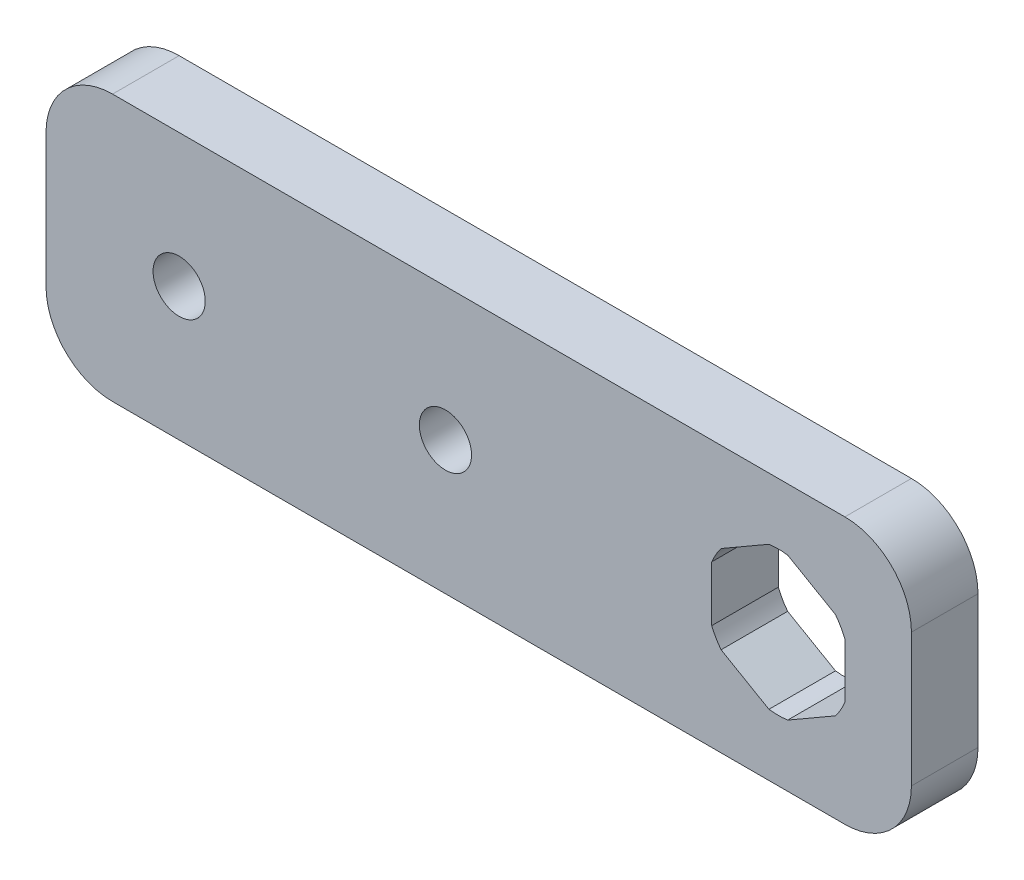
ISO-10303-21;
HEADER;
FILE_DESCRIPTION(('STEP AP214'),'2;1');
FILE_NAME('part.step','',(''),(''),'','','');
FILE_SCHEMA(('AUTOMOTIVE_DESIGN { 1 0 10303 214 1 1 1 1 }'));
ENDSEC;
DATA;
#1=APPLICATION_CONTEXT('core data for automotive mechanical design processes');
#2=APPLICATION_PROTOCOL_DEFINITION('international standard','automotive_design',2000,#1);
#3=PRODUCT_CONTEXT('',#1,'mechanical');
#4=PRODUCT('Part','Part','',(#3));
#5=PRODUCT_RELATED_PRODUCT_CATEGORY('part','',(#4));
#6=PRODUCT_DEFINITION_FORMATION('','',#4);
#7=PRODUCT_DEFINITION_CONTEXT('part definition',#1,'design');
#8=PRODUCT_DEFINITION('design','',#6,#7);
#9=PRODUCT_DEFINITION_SHAPE('','',#8);
#10=(LENGTH_UNIT() NAMED_UNIT(*) SI_UNIT(.MILLI.,.METRE.));
#11=(NAMED_UNIT(*) PLANE_ANGLE_UNIT() SI_UNIT($,.RADIAN.));
#12=(NAMED_UNIT(*) SI_UNIT($,.STERADIAN.) SOLID_ANGLE_UNIT());
#13=UNCERTAINTY_MEASURE_WITH_UNIT(LENGTH_MEASURE(1.E-05),#10,'distance_accuracy_value','');
#14=(GEOMETRIC_REPRESENTATION_CONTEXT(3) GLOBAL_UNCERTAINTY_ASSIGNED_CONTEXT((#13)) GLOBAL_UNIT_ASSIGNED_CONTEXT((#10,
#11,#12)) REPRESENTATION_CONTEXT('',''));
#15=CARTESIAN_POINT('',(0.,0.,0.));
#16=DIRECTION('',(0.,0.,1.));
#17=DIRECTION('',(1.,0.,0.));
#18=AXIS2_PLACEMENT_3D('',#15,#16,#17);
#19=CARTESIAN_POINT('',(114.3,169.926,-6.35));
#20=DIRECTION('',(-1.,0.,0.));
#21=DIRECTION('',(0.,-1.,0.));
#22=AXIS2_PLACEMENT_3D('',#19,#20,#21);
#23=PLANE('',#22);
#24=DIRECTION('',(0.,-1.,0.));
#25=VECTOR('',#24,1.);
#26=CARTESIAN_POINT('',(114.3,169.926,0.));
#27=LINE('',#26,#25);
#28=CARTESIAN_POINT('',(114.3,163.576,0.));
#29=VERTEX_POINT('',#28);
#30=CARTESIAN_POINT('',(114.3,150.876,0.));
#31=VERTEX_POINT('',#30);
#32=EDGE_CURVE('E303',#29,#31,#27,.T.);
#33=ORIENTED_EDGE('',*,*,#32,.F.);
#34=DIRECTION('',(0.,0.,1.));
#35=VECTOR('',#34,1.);
#36=CARTESIAN_POINT('',(114.3,163.576,-6.35));
#37=LINE('',#36,#35);
#38=CARTESIAN_POINT('',(114.3,163.576,-6.35));
#39=VERTEX_POINT('',#38);
#40=EDGE_CURVE('E386',#29,#39,#37,.F.);
#41=ORIENTED_EDGE('',*,*,#40,.T.);
#42=DIRECTION('',(0.,-1.,0.));
#43=VECTOR('',#42,1.);
#44=CARTESIAN_POINT('',(114.3,169.926,-6.35));
#45=LINE('',#44,#43);
#46=CARTESIAN_POINT('',(114.3,150.876,-6.35));
#47=VERTEX_POINT('',#46);
#48=EDGE_CURVE('E333',#39,#47,#45,.T.);
#49=ORIENTED_EDGE('',*,*,#48,.T.);
#50=DIRECTION('',(0.,0.,1.));
#51=VECTOR('',#50,1.);
#52=CARTESIAN_POINT('',(114.3,150.876,-6.35));
#53=LINE('',#52,#51);
#54=EDGE_CURVE('E382',#47,#31,#53,.T.);
#55=ORIENTED_EDGE('',*,*,#54,.T.);
#56=EDGE_LOOP('',(#33,#41,#49,#55));
#57=FACE_BOUND('',#56,.T.);
#58=ADVANCED_FACE('F47',(#57),#23,.T.);
#59=CARTESIAN_POINT('',(114.3,169.926,-6.35));
#60=DIRECTION('',(0.,1.,0.));
#61=DIRECTION('',(0.,0.,1.));
#62=AXIS2_PLACEMENT_3D('',#59,#60,#61);
#63=PLANE('',#62);
#64=DIRECTION('',(-1.,0.,0.));
#65=VECTOR('',#64,1.);
#66=CARTESIAN_POINT('',(114.3,169.926,-6.35));
#67=LINE('',#66,#65);
#68=CARTESIAN_POINT('',(190.5,169.926,-6.35));
#69=VERTEX_POINT('',#68);
#70=CARTESIAN_POINT('',(120.65,169.926,-6.35));
#71=VERTEX_POINT('',#70);
#72=EDGE_CURVE('E345',#69,#71,#67,.T.);
#73=ORIENTED_EDGE('',*,*,#72,.T.);
#74=DIRECTION('',(0.,0.,1.));
#75=VECTOR('',#74,1.);
#76=CARTESIAN_POINT('',(120.65,169.926,-6.35));
#77=LINE('',#76,#75);
#78=CARTESIAN_POINT('',(120.65,169.926,0.));
#79=VERTEX_POINT('',#78);
#80=EDGE_CURVE('E366',#71,#79,#77,.T.);
#81=ORIENTED_EDGE('',*,*,#80,.T.);
#82=DIRECTION('',(-1.,0.,0.));
#83=VECTOR('',#82,1.);
#84=CARTESIAN_POINT('',(114.3,169.926,0.));
#85=LINE('',#84,#83);
#86=CARTESIAN_POINT('',(190.5,169.926,0.));
#87=VERTEX_POINT('',#86);
#88=EDGE_CURVE('E338',#87,#79,#85,.T.);
#89=ORIENTED_EDGE('',*,*,#88,.F.);
#90=DIRECTION('',(0.,0.,1.));
#91=VECTOR('',#90,1.);
#92=CARTESIAN_POINT('',(190.5,169.926,-6.35));
#93=LINE('',#92,#91);
#94=EDGE_CURVE('E349',#87,#69,#93,.F.);
#95=ORIENTED_EDGE('',*,*,#94,.T.);
#96=EDGE_LOOP('',(#73,#81,#89,#95));
#97=FACE_BOUND('',#96,.T.);
#98=ADVANCED_FACE('F434',(#97),#63,.T.);
#99=CARTESIAN_POINT('',(196.85,169.926,-6.35));
#100=DIRECTION('',(1.,0.,0.));
#101=DIRECTION('',(0.,0.,-1.));
#102=AXIS2_PLACEMENT_3D('',#99,#100,#101);
#103=PLANE('',#102);
#104=DIRECTION('',(0.,1.,0.));
#105=VECTOR('',#104,1.);
#106=CARTESIAN_POINT('',(196.85,169.926,0.));
#107=LINE('',#106,#105);
#108=CARTESIAN_POINT('',(196.85,150.876,0.));
#109=VERTEX_POINT('',#108);
#110=CARTESIAN_POINT('',(196.85,163.576,0.));
#111=VERTEX_POINT('',#110);
#112=EDGE_CURVE('E357',#109,#111,#107,.T.);
#113=ORIENTED_EDGE('',*,*,#112,.F.);
#114=DIRECTION('',(0.,0.,1.));
#115=VECTOR('',#114,1.);
#116=CARTESIAN_POINT('',(196.85,150.876,-6.35));
#117=LINE('',#116,#115);
#118=CARTESIAN_POINT('',(196.85,150.876,-6.35));
#119=VERTEX_POINT('',#118);
#120=EDGE_CURVE('E11',#109,#119,#117,.F.);
#121=ORIENTED_EDGE('',*,*,#120,.T.);
#122=DIRECTION('',(0.,1.,0.));
#123=VECTOR('',#122,1.);
#124=CARTESIAN_POINT('',(196.85,169.926,-6.35));
#125=LINE('',#124,#123);
#126=CARTESIAN_POINT('',(196.85,163.576,-6.35));
#127=VERTEX_POINT('',#126);
#128=EDGE_CURVE('E341',#119,#127,#125,.T.);
#129=ORIENTED_EDGE('',*,*,#128,.T.);
#130=DIRECTION('',(0.,0.,1.));
#131=VECTOR('',#130,1.);
#132=CARTESIAN_POINT('',(196.85,163.576,-6.35));
#133=LINE('',#132,#131);
#134=EDGE_CURVE('E56',#127,#111,#133,.T.);
#135=ORIENTED_EDGE('',*,*,#134,.T.);
#136=EDGE_LOOP('',(#113,#121,#129,#135));
#137=FACE_BOUND('',#136,.T.);
#138=ADVANCED_FACE('F410',(#137),#103,.T.);
#139=CARTESIAN_POINT('',(114.3,144.526,-6.35));
#140=DIRECTION('',(0.,-1.,0.));
#141=DIRECTION('',(0.,0.,-1.));
#142=AXIS2_PLACEMENT_3D('',#139,#140,#141);
#143=PLANE('',#142);
#144=DIRECTION('',(1.,0.,0.));
#145=VECTOR('',#144,1.);
#146=CARTESIAN_POINT('',(114.3,144.526,0.));
#147=LINE('',#146,#145);
#148=CARTESIAN_POINT('',(120.65,144.526,0.));
#149=VERTEX_POINT('',#148);
#150=CARTESIAN_POINT('',(190.5,144.526,0.));
#151=VERTEX_POINT('',#150);
#152=EDGE_CURVE('E353',#149,#151,#147,.T.);
#153=ORIENTED_EDGE('',*,*,#152,.F.);
#154=DIRECTION('',(0.,0.,1.));
#155=VECTOR('',#154,1.);
#156=CARTESIAN_POINT('',(120.65,144.526,-6.35));
#157=LINE('',#156,#155);
#158=CARTESIAN_POINT('',(120.65,144.526,-6.35));
#159=VERTEX_POINT('',#158);
#160=EDGE_CURVE('E70',#149,#159,#157,.F.);
#161=ORIENTED_EDGE('',*,*,#160,.T.);
#162=DIRECTION('',(1.,0.,0.));
#163=VECTOR('',#162,1.);
#164=CARTESIAN_POINT('',(114.3,144.526,-6.35));
#165=LINE('',#164,#163);
#166=CARTESIAN_POINT('',(190.5,144.526,-6.35));
#167=VERTEX_POINT('',#166);
#168=EDGE_CURVE('E337',#159,#167,#165,.T.);
#169=ORIENTED_EDGE('',*,*,#168,.T.);
#170=DIRECTION('',(0.,0.,1.));
#171=VECTOR('',#170,1.);
#172=CARTESIAN_POINT('',(190.5,144.526,-6.35));
#173=LINE('',#172,#171);
#174=EDGE_CURVE('E400',#167,#151,#173,.T.);
#175=ORIENTED_EDGE('',*,*,#174,.T.);
#176=EDGE_LOOP('',(#153,#161,#169,#175));
#177=FACE_BOUND('',#176,.T.);
#178=ADVANCED_FACE('F420',(#177),#143,.T.);
#179=CARTESIAN_POINT('',(0.,0.,-6.35));
#180=DIRECTION('',(0.,0.,1.));
#181=DIRECTION('',(1.,0.,0.));
#182=AXIS2_PLACEMENT_3D('',#179,#180,#181);
#183=PLANE('',#182);
#184=CARTESIAN_POINT('',(152.4,157.226,-6.35));
#185=DIRECTION('',(0.,0.,1.));
#186=DIRECTION('',(1.,0.,0.));
#187=AXIS2_PLACEMENT_3D('',#184,#185,#186);
#188=CIRCLE('',#187,2.48920000000001);
#189=CARTESIAN_POINT('',(154.8892,157.226,-6.35));
#190=VERTEX_POINT('',#189);
#191=EDGE_CURVE('E642',#190,#190,#188,.T.);
#192=ORIENTED_EDGE('',*,*,#191,.T.);
#193=EDGE_LOOP('',(#192));
#194=FACE_BOUND('',#193,.T.);
#195=CARTESIAN_POINT('',(127.,157.226,-6.35));
#196=DIRECTION('',(0.,0.,1.));
#197=DIRECTION('',(1.,0.,0.));
#198=AXIS2_PLACEMENT_3D('',#195,#196,#197);
#199=CIRCLE('',#198,2.48920000000001);
#200=CARTESIAN_POINT('',(129.4892,157.226,-6.35));
#201=VERTEX_POINT('',#200);
#202=EDGE_CURVE('E262',#201,#201,#199,.T.);
#203=ORIENTED_EDGE('',*,*,#202,.T.);
#204=EDGE_LOOP('',(#203));
#205=FACE_BOUND('',#204,.T.);
#206=DIRECTION('',(-0.866025403784439,0.499999999999999,0.));
#207=VECTOR('',#206,1.);
#208=CARTESIAN_POINT('',(189.606960428968,161.407770846087,-6.35));
#209=LINE('',#208,#207);
#210=CARTESIAN_POINT('',(189.606960428968,161.407770846087,-6.35));
#211=VERTEX_POINT('',#210);
#212=CARTESIAN_POINT('',(185.043039571032,164.042751781976,-6.35));
#213=VERTEX_POINT('',#212);
#214=EDGE_CURVE('E199',#211,#213,#209,.T.);
#215=ORIENTED_EDGE('',*,*,#214,.T.);
#216=CARTESIAN_POINT('',(184.15,157.226,-6.35));
#217=DIRECTION('',(0.,0.,1.));
#218=DIRECTION('',(1.,0.,0.));
#219=AXIS2_PLACEMENT_3D('',#216,#217,#218);
#220=CIRCLE('',#219,6.874999966);
#221=CARTESIAN_POINT('',(183.256960428968,164.042751781976,-6.35));
#222=VERTEX_POINT('',#221);
#223=EDGE_CURVE('E190',#213,#222,#220,.T.);
#224=ORIENTED_EDGE('',*,*,#223,.T.);
#225=DIRECTION('',(-0.866025403784439,-0.5,0.));
#226=VECTOR('',#225,1.);
#227=CARTESIAN_POINT('',(183.256960428968,164.042751781976,-6.35));
#228=LINE('',#227,#226);
#229=CARTESIAN_POINT('',(178.693039571032,161.407770846087,-6.35));
#230=VERTEX_POINT('',#229);
#231=EDGE_CURVE('E203',#222,#230,#228,.T.);
#232=ORIENTED_EDGE('',*,*,#231,.T.);
#233=CARTESIAN_POINT('',(184.15,157.226,-6.35));
#234=DIRECTION('',(0.,0.,1.));
#235=DIRECTION('',(1.,0.,0.));
#236=AXIS2_PLACEMENT_3D('',#233,#234,#235);
#237=CIRCLE('',#236,6.874999966);
#238=CARTESIAN_POINT('',(177.8,159.860980935889,-6.35));
#239=VERTEX_POINT('',#238);
#240=EDGE_CURVE('E208',#230,#239,#237,.T.);
#241=ORIENTED_EDGE('',*,*,#240,.T.);
#242=DIRECTION('',(0.,-1.,0.));
#243=VECTOR('',#242,1.);
#244=CARTESIAN_POINT('',(177.8,159.860980935889,-6.35));
#245=LINE('',#244,#243);
#246=CARTESIAN_POINT('',(177.8,154.591019064111,-6.35));
#247=VERTEX_POINT('',#246);
#248=EDGE_CURVE('E226',#239,#247,#245,.T.);
#249=ORIENTED_EDGE('',*,*,#248,.T.);
#250=CARTESIAN_POINT('',(184.15,157.226,-6.35));
#251=DIRECTION('',(0.,0.,1.));
#252=DIRECTION('',(1.,0.,0.));
#253=AXIS2_PLACEMENT_3D('',#250,#251,#252);
#254=CIRCLE('',#253,6.874999966);
#255=CARTESIAN_POINT('',(178.693039571032,153.044229153913,-6.35));
#256=VERTEX_POINT('',#255);
#257=EDGE_CURVE('E230',#247,#256,#254,.T.);
#258=ORIENTED_EDGE('',*,*,#257,.T.);
#259=DIRECTION('',(0.866025403784442,-0.499999999999994,0.));
#260=VECTOR('',#259,1.);
#261=CARTESIAN_POINT('',(178.693039571032,153.044229153913,-6.35));
#262=LINE('',#261,#260);
#263=CARTESIAN_POINT('',(183.256960428967,150.409248218024,-6.35));
#264=VERTEX_POINT('',#263);
#265=EDGE_CURVE('E234',#256,#264,#262,.T.);
#266=ORIENTED_EDGE('',*,*,#265,.T.);
#267=CARTESIAN_POINT('',(184.15,157.226,-6.35));
#268=DIRECTION('',(0.,0.,1.));
#269=DIRECTION('',(1.,0.,0.));
#270=AXIS2_PLACEMENT_3D('',#267,#268,#269);
#271=CIRCLE('',#270,6.87499996600001);
#272=CARTESIAN_POINT('',(185.043039571033,150.409248218024,-6.35));
#273=VERTEX_POINT('',#272);
#274=EDGE_CURVE('E238',#264,#273,#271,.T.);
#275=ORIENTED_EDGE('',*,*,#274,.T.);
#276=DIRECTION('',(0.866025403784441,0.499999999999995,0.));
#277=VECTOR('',#276,1.);
#278=CARTESIAN_POINT('',(185.043039571033,150.409248218024,-6.35));
#279=LINE('',#278,#277);
#280=CARTESIAN_POINT('',(189.606960428968,153.044229153913,-6.35));
#281=VERTEX_POINT('',#280);
#282=EDGE_CURVE('E242',#273,#281,#279,.T.);
#283=ORIENTED_EDGE('',*,*,#282,.T.);
#284=CARTESIAN_POINT('',(184.15,157.226,-6.35));
#285=DIRECTION('',(0.,0.,1.));
#286=DIRECTION('',(1.,0.,0.));
#287=AXIS2_PLACEMENT_3D('',#284,#285,#286);
#288=CIRCLE('',#287,6.87499996600001);
#289=CARTESIAN_POINT('',(190.5,154.591019064111,-6.35));
#290=VERTEX_POINT('',#289);
#291=EDGE_CURVE('E246',#281,#290,#288,.T.);
#292=ORIENTED_EDGE('',*,*,#291,.T.);
#293=DIRECTION('',(0.,1.,0.));
#294=VECTOR('',#293,1.);
#295=CARTESIAN_POINT('',(190.5,154.591019064111,-6.35));
#296=LINE('',#295,#294);
#297=CARTESIAN_POINT('',(190.5,159.860980935889,-6.35));
#298=VERTEX_POINT('',#297);
#299=EDGE_CURVE('E250',#290,#298,#296,.T.);
#300=ORIENTED_EDGE('',*,*,#299,.T.);
#301=CARTESIAN_POINT('',(184.15,157.226,-6.35));
#302=DIRECTION('',(0.,0.,1.));
#303=DIRECTION('',(1.,0.,0.));
#304=AXIS2_PLACEMENT_3D('',#301,#302,#303);
#305=CIRCLE('',#304,6.874999966);
#306=EDGE_CURVE('E254',#298,#211,#305,.T.);
#307=ORIENTED_EDGE('',*,*,#306,.T.);
#308=EDGE_LOOP('',(#215,#224,#232,#241,#249,#258,#266,#275,#283,#292,#300,#307));
#309=FACE_BOUND('',#308,.T.);
#310=ORIENTED_EDGE('',*,*,#48,.F.);
#311=CARTESIAN_POINT('',(120.65,163.576,-6.35));
#312=DIRECTION('',(0.,0.,1.));
#313=DIRECTION('',(1.,0.,0.));
#314=AXIS2_PLACEMENT_3D('',#311,#312,#313);
#315=CIRCLE('',#314,6.35);
#316=EDGE_CURVE('E397',#39,#71,#315,.F.);
#317=ORIENTED_EDGE('',*,*,#316,.T.);
#318=ORIENTED_EDGE('',*,*,#72,.F.);
#319=CARTESIAN_POINT('',(190.5,163.576,-6.35));
#320=DIRECTION('',(0.,0.,1.));
#321=DIRECTION('',(1.,0.,0.));
#322=AXIS2_PLACEMENT_3D('',#319,#320,#321);
#323=CIRCLE('',#322,6.35);
#324=EDGE_CURVE('E389',#69,#127,#323,.F.);
#325=ORIENTED_EDGE('',*,*,#324,.T.);
#326=ORIENTED_EDGE('',*,*,#128,.F.);
#327=CARTESIAN_POINT('',(190.5,150.876,-6.35));
#328=DIRECTION('',(0.,0.,1.));
#329=DIRECTION('',(1.,0.,0.));
#330=AXIS2_PLACEMENT_3D('',#327,#328,#329);
#331=CIRCLE('',#330,6.35);
#332=EDGE_CURVE('E63',#119,#167,#331,.F.);
#333=ORIENTED_EDGE('',*,*,#332,.T.);
#334=ORIENTED_EDGE('',*,*,#168,.F.);
#335=CARTESIAN_POINT('',(120.65,150.876,-6.35));
#336=DIRECTION('',(0.,0.,1.));
#337=DIRECTION('',(1.,0.,0.));
#338=AXIS2_PLACEMENT_3D('',#335,#336,#337);
#339=CIRCLE('',#338,6.35);
#340=EDGE_CURVE('E394',#159,#47,#339,.F.);
#341=ORIENTED_EDGE('',*,*,#340,.T.);
#342=EDGE_LOOP('',(#310,#317,#318,#325,#326,#333,#334,#341));
#343=FACE_BOUND('',#342,.T.);
#344=ADVANCED_FACE('F210',(#194,#205,#309,#343),#183,.F.);
#345=CARTESIAN_POINT('',(0.,0.,0.));
#346=DIRECTION('',(0.,0.,1.));
#347=DIRECTION('',(1.,0.,0.));
#348=AXIS2_PLACEMENT_3D('',#345,#346,#347);
#349=PLANE('',#348);
#350=CARTESIAN_POINT('',(152.4,157.226,0.));
#351=DIRECTION('',(0.,0.,1.));
#352=DIRECTION('',(1.,0.,0.));
#353=AXIS2_PLACEMENT_3D('',#350,#351,#352);
#354=CIRCLE('',#353,2.48920000000001);
#355=CARTESIAN_POINT('',(154.8892,157.226,0.));
#356=VERTEX_POINT('',#355);
#357=EDGE_CURVE('E649',#356,#356,#354,.T.);
#358=ORIENTED_EDGE('',*,*,#357,.F.);
#359=EDGE_LOOP('',(#358));
#360=FACE_BOUND('',#359,.T.);
#361=CARTESIAN_POINT('',(127.,157.226,0.));
#362=DIRECTION('',(0.,0.,1.));
#363=DIRECTION('',(1.,0.,0.));
#364=AXIS2_PLACEMENT_3D('',#361,#362,#363);
#365=CIRCLE('',#364,2.48920000000001);
#366=CARTESIAN_POINT('',(129.4892,157.226,0.));
#367=VERTEX_POINT('',#366);
#368=EDGE_CURVE('E221',#367,#367,#365,.T.);
#369=ORIENTED_EDGE('',*,*,#368,.F.);
#370=EDGE_LOOP('',(#369));
#371=FACE_BOUND('',#370,.T.);
#372=CARTESIAN_POINT('',(184.15,157.226,0.));
#373=DIRECTION('',(0.,0.,1.));
#374=DIRECTION('',(1.,0.,0.));
#375=AXIS2_PLACEMENT_3D('',#372,#373,#374);
#376=CIRCLE('',#375,6.874999966);
#377=CARTESIAN_POINT('',(185.043039571032,164.042751781976,0.));
#378=VERTEX_POINT('',#377);
#379=CARTESIAN_POINT('',(183.256960428968,164.042751781976,0.));
#380=VERTEX_POINT('',#379);
#381=EDGE_CURVE('E193',#378,#380,#376,.T.);
#382=ORIENTED_EDGE('',*,*,#381,.F.);
#383=DIRECTION('',(-0.866025403784439,0.499999999999999,0.));
#384=VECTOR('',#383,1.);
#385=CARTESIAN_POINT('',(189.606960428968,161.407770846087,0.));
#386=LINE('',#385,#384);
#387=CARTESIAN_POINT('',(189.606960428968,161.407770846087,0.));
#388=VERTEX_POINT('',#387);
#389=EDGE_CURVE('E214',#388,#378,#386,.T.);
#390=ORIENTED_EDGE('',*,*,#389,.F.);
#391=CARTESIAN_POINT('',(184.15,157.226,0.));
#392=DIRECTION('',(0.,0.,1.));
#393=DIRECTION('',(1.,0.,0.));
#394=AXIS2_PLACEMENT_3D('',#391,#392,#393);
#395=CIRCLE('',#394,6.874999966);
#396=CARTESIAN_POINT('',(190.5,159.860980935889,0.));
#397=VERTEX_POINT('',#396);
#398=EDGE_CURVE('E218',#397,#388,#395,.T.);
#399=ORIENTED_EDGE('',*,*,#398,.F.);
#400=DIRECTION('',(0.,1.,0.));
#401=VECTOR('',#400,1.);
#402=CARTESIAN_POINT('',(190.5,154.591019064111,0.));
#403=LINE('',#402,#401);
#404=CARTESIAN_POINT('',(190.5,154.591019064111,0.));
#405=VERTEX_POINT('',#404);
#406=EDGE_CURVE('E293',#405,#397,#403,.T.);
#407=ORIENTED_EDGE('',*,*,#406,.F.);
#408=CARTESIAN_POINT('',(184.15,157.226,0.));
#409=DIRECTION('',(0.,0.,1.));
#410=DIRECTION('',(1.,0.,0.));
#411=AXIS2_PLACEMENT_3D('',#408,#409,#410);
#412=CIRCLE('',#411,6.87499996600001);
#413=CARTESIAN_POINT('',(189.606960428968,153.044229153913,0.));
#414=VERTEX_POINT('',#413);
#415=EDGE_CURVE('E289',#414,#405,#412,.T.);
#416=ORIENTED_EDGE('',*,*,#415,.F.);
#417=DIRECTION('',(0.866025403784441,0.499999999999995,0.));
#418=VECTOR('',#417,1.);
#419=CARTESIAN_POINT('',(185.043039571033,150.409248218024,0.));
#420=LINE('',#419,#418);
#421=CARTESIAN_POINT('',(185.043039571033,150.409248218024,0.));
#422=VERTEX_POINT('',#421);
#423=EDGE_CURVE('E285',#422,#414,#420,.T.);
#424=ORIENTED_EDGE('',*,*,#423,.F.);
#425=CARTESIAN_POINT('',(184.15,157.226,0.));
#426=DIRECTION('',(0.,0.,1.));
#427=DIRECTION('',(1.,0.,0.));
#428=AXIS2_PLACEMENT_3D('',#425,#426,#427);
#429=CIRCLE('',#428,6.87499996600001);
#430=CARTESIAN_POINT('',(183.256960428967,150.409248218024,0.));
#431=VERTEX_POINT('',#430);
#432=EDGE_CURVE('E281',#431,#422,#429,.T.);
#433=ORIENTED_EDGE('',*,*,#432,.F.);
#434=DIRECTION('',(0.866025403784442,-0.499999999999994,0.));
#435=VECTOR('',#434,1.);
#436=CARTESIAN_POINT('',(178.693039571032,153.044229153913,0.));
#437=LINE('',#436,#435);
#438=CARTESIAN_POINT('',(178.693039571032,153.044229153913,0.));
#439=VERTEX_POINT('',#438);
#440=EDGE_CURVE('E277',#439,#431,#437,.T.);
#441=ORIENTED_EDGE('',*,*,#440,.F.);
#442=CARTESIAN_POINT('',(184.15,157.226,0.));
#443=DIRECTION('',(0.,0.,1.));
#444=DIRECTION('',(1.,0.,0.));
#445=AXIS2_PLACEMENT_3D('',#442,#443,#444);
#446=CIRCLE('',#445,6.874999966);
#447=CARTESIAN_POINT('',(177.8,154.591019064111,0.));
#448=VERTEX_POINT('',#447);
#449=EDGE_CURVE('E273',#448,#439,#446,.T.);
#450=ORIENTED_EDGE('',*,*,#449,.F.);
#451=DIRECTION('',(0.,-1.,0.));
#452=VECTOR('',#451,1.);
#453=CARTESIAN_POINT('',(177.8,159.860980935889,0.));
#454=LINE('',#453,#452);
#455=CARTESIAN_POINT('',(177.8,159.860980935889,0.));
#456=VERTEX_POINT('',#455);
#457=EDGE_CURVE('E269',#456,#448,#454,.T.);
#458=ORIENTED_EDGE('',*,*,#457,.F.);
#459=CARTESIAN_POINT('',(184.15,157.226,0.));
#460=DIRECTION('',(0.,0.,1.));
#461=DIRECTION('',(1.,0.,0.));
#462=AXIS2_PLACEMENT_3D('',#459,#460,#461);
#463=CIRCLE('',#462,6.874999966);
#464=CARTESIAN_POINT('',(178.693039571032,161.407770846087,0.));
#465=VERTEX_POINT('',#464);
#466=EDGE_CURVE('E265',#465,#456,#463,.T.);
#467=ORIENTED_EDGE('',*,*,#466,.F.);
#468=DIRECTION('',(-0.866025403784439,-0.5,0.));
#469=VECTOR('',#468,1.);
#470=CARTESIAN_POINT('',(183.256960428968,164.042751781976,0.));
#471=LINE('',#470,#469);
#472=EDGE_CURVE('E261',#380,#465,#471,.T.);
#473=ORIENTED_EDGE('',*,*,#472,.F.);
#474=EDGE_LOOP('',(#382,#390,#399,#407,#416,#424,#433,#441,#450,#458,#467,#473));
#475=FACE_BOUND('',#474,.T.);
#476=ORIENTED_EDGE('',*,*,#88,.T.);
#477=CARTESIAN_POINT('',(120.65,163.576,0.));
#478=DIRECTION('',(0.,0.,1.));
#479=DIRECTION('',(1.,0.,0.));
#480=AXIS2_PLACEMENT_3D('',#477,#478,#479);
#481=CIRCLE('',#480,6.35);
#482=EDGE_CURVE('E379',#79,#29,#481,.T.);
#483=ORIENTED_EDGE('',*,*,#482,.T.);
#484=ORIENTED_EDGE('',*,*,#32,.T.);
#485=CARTESIAN_POINT('',(120.65,150.876,0.));
#486=DIRECTION('',(0.,0.,1.));
#487=DIRECTION('',(1.,0.,0.));
#488=AXIS2_PLACEMENT_3D('',#485,#486,#487);
#489=CIRCLE('',#488,6.35);
#490=EDGE_CURVE('E376',#31,#149,#489,.T.);
#491=ORIENTED_EDGE('',*,*,#490,.T.);
#492=ORIENTED_EDGE('',*,*,#152,.T.);
#493=CARTESIAN_POINT('',(190.5,150.876,0.));
#494=DIRECTION('',(0.,0.,1.));
#495=DIRECTION('',(1.,0.,0.));
#496=AXIS2_PLACEMENT_3D('',#493,#494,#495);
#497=CIRCLE('',#496,6.35);
#498=EDGE_CURVE('E373',#151,#109,#497,.T.);
#499=ORIENTED_EDGE('',*,*,#498,.T.);
#500=ORIENTED_EDGE('',*,*,#112,.T.);
#501=CARTESIAN_POINT('',(190.5,163.576,0.));
#502=DIRECTION('',(0.,0.,1.));
#503=DIRECTION('',(1.,0.,0.));
#504=AXIS2_PLACEMENT_3D('',#501,#502,#503);
#505=CIRCLE('',#504,6.35);
#506=EDGE_CURVE('E370',#111,#87,#505,.T.);
#507=ORIENTED_EDGE('',*,*,#506,.T.);
#508=EDGE_LOOP('',(#476,#483,#484,#491,#492,#499,#500,#507));
#509=FACE_BOUND('',#508,.T.);
#510=ADVANCED_FACE('F415',(#360,#371,#475,#509),#349,.T.);
#511=CARTESIAN_POINT('',(184.15,157.226,-6.35));
#512=DIRECTION('',(0.,0.,1.));
#513=DIRECTION('',(1.,0.,0.));
#514=AXIS2_PLACEMENT_3D('',#511,#512,#513);
#515=CYLINDRICAL_SURFACE('',#514,6.874999966);
#516=ORIENTED_EDGE('',*,*,#381,.T.);
#517=DIRECTION('',(0.,0.,1.));
#518=VECTOR('',#517,1.);
#519=CARTESIAN_POINT('',(183.256960428968,164.042751781976,-6.35));
#520=LINE('',#519,#518);
#521=EDGE_CURVE('E186',#222,#380,#520,.T.);
#522=ORIENTED_EDGE('',*,*,#521,.F.);
#523=ORIENTED_EDGE('',*,*,#223,.F.);
#524=DIRECTION('',(0.,0.,1.));
#525=VECTOR('',#524,1.);
#526=CARTESIAN_POINT('',(185.043039571032,164.042751781976,-6.35));
#527=LINE('',#526,#525);
#528=EDGE_CURVE('E300',#213,#378,#527,.T.);
#529=ORIENTED_EDGE('',*,*,#528,.T.);
#530=EDGE_LOOP('',(#516,#522,#523,#529));
#531=FACE_BOUND('',#530,.T.);
#532=ADVANCED_FACE('F188',(#531),#515,.F.);
#533=CARTESIAN_POINT('',(189.606960428968,161.407770846087,-6.35));
#534=DIRECTION('',(0.499999999999999,0.866025403784439,0.));
#535=DIRECTION('',(-0.866025403784439,0.499999999999999,0.));
#536=AXIS2_PLACEMENT_3D('',#533,#534,#535);
#537=PLANE('',#536);
#538=ORIENTED_EDGE('',*,*,#389,.T.);
#539=ORIENTED_EDGE('',*,*,#528,.F.);
#540=ORIENTED_EDGE('',*,*,#214,.F.);
#541=DIRECTION('',(0.,0.,1.));
#542=VECTOR('',#541,1.);
#543=CARTESIAN_POINT('',(189.606960428968,161.407770846087,-6.35));
#544=LINE('',#543,#542);
#545=EDGE_CURVE('E304',#211,#388,#544,.T.);
#546=ORIENTED_EDGE('',*,*,#545,.T.);
#547=EDGE_LOOP('',(#538,#539,#540,#546));
#548=FACE_BOUND('',#547,.T.);
#549=ADVANCED_FACE('F579',(#548),#537,.F.);
#550=CARTESIAN_POINT('',(184.15,157.226,-6.35));
#551=DIRECTION('',(0.,0.,1.));
#552=DIRECTION('',(1.,0.,0.));
#553=AXIS2_PLACEMENT_3D('',#550,#551,#552);
#554=CYLINDRICAL_SURFACE('',#553,6.874999966);
#555=ORIENTED_EDGE('',*,*,#398,.T.);
#556=ORIENTED_EDGE('',*,*,#545,.F.);
#557=ORIENTED_EDGE('',*,*,#306,.F.);
#558=DIRECTION('',(0.,0.,1.));
#559=VECTOR('',#558,1.);
#560=CARTESIAN_POINT('',(190.5,159.860980935889,-6.35));
#561=LINE('',#560,#559);
#562=EDGE_CURVE('E307',#298,#397,#561,.T.);
#563=ORIENTED_EDGE('',*,*,#562,.T.);
#564=EDGE_LOOP('',(#555,#556,#557,#563));
#565=FACE_BOUND('',#564,.T.);
#566=ADVANCED_FACE('F570',(#565),#554,.F.);
#567=CARTESIAN_POINT('',(190.5,154.591019064111,-6.35));
#568=DIRECTION('',(1.,0.,0.));
#569=DIRECTION('',(0.,0.,-1.));
#570=AXIS2_PLACEMENT_3D('',#567,#568,#569);
#571=PLANE('',#570);
#572=ORIENTED_EDGE('',*,*,#406,.T.);
#573=ORIENTED_EDGE('',*,*,#562,.F.);
#574=ORIENTED_EDGE('',*,*,#299,.F.);
#575=DIRECTION('',(0.,0.,1.));
#576=VECTOR('',#575,1.);
#577=CARTESIAN_POINT('',(190.5,154.591019064111,-6.35));
#578=LINE('',#577,#576);
#579=EDGE_CURVE('E310',#290,#405,#578,.T.);
#580=ORIENTED_EDGE('',*,*,#579,.T.);
#581=EDGE_LOOP('',(#572,#573,#574,#580));
#582=FACE_BOUND('',#581,.T.);
#583=ADVANCED_FACE('F561',(#582),#571,.F.);
#584=CARTESIAN_POINT('',(184.15,157.226,-6.35));
#585=DIRECTION('',(0.,0.,1.));
#586=DIRECTION('',(1.,0.,0.));
#587=AXIS2_PLACEMENT_3D('',#584,#585,#586);
#588=CYLINDRICAL_SURFACE('',#587,6.87499996600001);
#589=ORIENTED_EDGE('',*,*,#415,.T.);
#590=ORIENTED_EDGE('',*,*,#579,.F.);
#591=ORIENTED_EDGE('',*,*,#291,.F.);
#592=DIRECTION('',(0.,0.,1.));
#593=VECTOR('',#592,1.);
#594=CARTESIAN_POINT('',(189.606960428968,153.044229153913,-6.35));
#595=LINE('',#594,#593);
#596=EDGE_CURVE('E313',#281,#414,#595,.T.);
#597=ORIENTED_EDGE('',*,*,#596,.T.);
#598=EDGE_LOOP('',(#589,#590,#591,#597));
#599=FACE_BOUND('',#598,.T.);
#600=ADVANCED_FACE('F552',(#599),#588,.F.);
#601=CARTESIAN_POINT('',(185.043039571033,150.409248218024,-6.35));
#602=DIRECTION('',(0.499999999999995,-0.866025403784441,0.));
#603=DIRECTION('',(0.866025403784441,0.499999999999995,0.));
#604=AXIS2_PLACEMENT_3D('',#601,#602,#603);
#605=PLANE('',#604);
#606=ORIENTED_EDGE('',*,*,#423,.T.);
#607=ORIENTED_EDGE('',*,*,#596,.F.);
#608=ORIENTED_EDGE('',*,*,#282,.F.);
#609=DIRECTION('',(0.,0.,1.));
#610=VECTOR('',#609,1.);
#611=CARTESIAN_POINT('',(185.043039571033,150.409248218024,-6.35));
#612=LINE('',#611,#610);
#613=EDGE_CURVE('E316',#273,#422,#612,.T.);
#614=ORIENTED_EDGE('',*,*,#613,.T.);
#615=EDGE_LOOP('',(#606,#607,#608,#614));
#616=FACE_BOUND('',#615,.T.);
#617=ADVANCED_FACE('F543',(#616),#605,.F.);
#618=CARTESIAN_POINT('',(184.15,157.226,-6.35));
#619=DIRECTION('',(0.,0.,1.));
#620=DIRECTION('',(1.,0.,0.));
#621=AXIS2_PLACEMENT_3D('',#618,#619,#620);
#622=CYLINDRICAL_SURFACE('',#621,6.87499996600001);
#623=ORIENTED_EDGE('',*,*,#432,.T.);
#624=ORIENTED_EDGE('',*,*,#613,.F.);
#625=ORIENTED_EDGE('',*,*,#274,.F.);
#626=DIRECTION('',(0.,0.,1.));
#627=VECTOR('',#626,1.);
#628=CARTESIAN_POINT('',(183.256960428967,150.409248218024,-6.35));
#629=LINE('',#628,#627);
#630=EDGE_CURVE('E319',#264,#431,#629,.T.);
#631=ORIENTED_EDGE('',*,*,#630,.T.);
#632=EDGE_LOOP('',(#623,#624,#625,#631));
#633=FACE_BOUND('',#632,.T.);
#634=ADVANCED_FACE('F534',(#633),#622,.F.);
#635=CARTESIAN_POINT('',(178.693039571032,153.044229153913,-6.35));
#636=DIRECTION('',(-0.499999999999994,-0.866025403784442,0.));
#637=DIRECTION('',(0.866025403784442,-0.499999999999994,0.));
#638=AXIS2_PLACEMENT_3D('',#635,#636,#637);
#639=PLANE('',#638);
#640=ORIENTED_EDGE('',*,*,#440,.T.);
#641=ORIENTED_EDGE('',*,*,#630,.F.);
#642=ORIENTED_EDGE('',*,*,#265,.F.);
#643=DIRECTION('',(0.,0.,1.));
#644=VECTOR('',#643,1.);
#645=CARTESIAN_POINT('',(178.693039571032,153.044229153913,-6.35));
#646=LINE('',#645,#644);
#647=EDGE_CURVE('E322',#256,#439,#646,.T.);
#648=ORIENTED_EDGE('',*,*,#647,.T.);
#649=EDGE_LOOP('',(#640,#641,#642,#648));
#650=FACE_BOUND('',#649,.T.);
#651=ADVANCED_FACE('F525',(#650),#639,.F.);
#652=CARTESIAN_POINT('',(184.15,157.226,-6.35));
#653=DIRECTION('',(0.,0.,1.));
#654=DIRECTION('',(1.,0.,0.));
#655=AXIS2_PLACEMENT_3D('',#652,#653,#654);
#656=CYLINDRICAL_SURFACE('',#655,6.874999966);
#657=ORIENTED_EDGE('',*,*,#449,.T.);
#658=ORIENTED_EDGE('',*,*,#647,.F.);
#659=ORIENTED_EDGE('',*,*,#257,.F.);
#660=DIRECTION('',(0.,0.,1.));
#661=VECTOR('',#660,1.);
#662=CARTESIAN_POINT('',(177.8,154.591019064111,-6.35));
#663=LINE('',#662,#661);
#664=EDGE_CURVE('E325',#247,#448,#663,.T.);
#665=ORIENTED_EDGE('',*,*,#664,.T.);
#666=EDGE_LOOP('',(#657,#658,#659,#665));
#667=FACE_BOUND('',#666,.T.);
#668=ADVANCED_FACE('F516',(#667),#656,.F.);
#669=CARTESIAN_POINT('',(177.8,159.860980935889,-6.35));
#670=DIRECTION('',(-1.,0.,0.));
#671=DIRECTION('',(0.,0.,1.));
#672=AXIS2_PLACEMENT_3D('',#669,#670,#671);
#673=PLANE('',#672);
#674=ORIENTED_EDGE('',*,*,#457,.T.);
#675=ORIENTED_EDGE('',*,*,#664,.F.);
#676=ORIENTED_EDGE('',*,*,#248,.F.);
#677=DIRECTION('',(0.,0.,1.));
#678=VECTOR('',#677,1.);
#679=CARTESIAN_POINT('',(177.8,159.860980935889,-6.35));
#680=LINE('',#679,#678);
#681=EDGE_CURVE('E328',#239,#456,#680,.T.);
#682=ORIENTED_EDGE('',*,*,#681,.T.);
#683=EDGE_LOOP('',(#674,#675,#676,#682));
#684=FACE_BOUND('',#683,.T.);
#685=ADVANCED_FACE('F507',(#684),#673,.F.);
#686=CARTESIAN_POINT('',(184.15,157.226,-6.35));
#687=DIRECTION('',(0.,0.,1.));
#688=DIRECTION('',(1.,0.,0.));
#689=AXIS2_PLACEMENT_3D('',#686,#687,#688);
#690=CYLINDRICAL_SURFACE('',#689,6.874999966);
#691=ORIENTED_EDGE('',*,*,#466,.T.);
#692=ORIENTED_EDGE('',*,*,#681,.F.);
#693=ORIENTED_EDGE('',*,*,#240,.F.);
#694=DIRECTION('',(0.,0.,1.));
#695=VECTOR('',#694,1.);
#696=CARTESIAN_POINT('',(178.693039571032,161.407770846087,-6.35));
#697=LINE('',#696,#695);
#698=EDGE_CURVE('E198',#230,#465,#697,.T.);
#699=ORIENTED_EDGE('',*,*,#698,.T.);
#700=EDGE_LOOP('',(#691,#692,#693,#699));
#701=FACE_BOUND('',#700,.T.);
#702=ADVANCED_FACE('F499',(#701),#690,.F.);
#703=CARTESIAN_POINT('',(183.256960428968,164.042751781976,-6.35));
#704=DIRECTION('',(-0.5,0.866025403784439,0.));
#705=DIRECTION('',(-0.866025403784439,-0.5,0.));
#706=AXIS2_PLACEMENT_3D('',#703,#704,#705);
#707=PLANE('',#706);
#708=ORIENTED_EDGE('',*,*,#472,.T.);
#709=ORIENTED_EDGE('',*,*,#698,.F.);
#710=ORIENTED_EDGE('',*,*,#231,.F.);
#711=ORIENTED_EDGE('',*,*,#521,.T.);
#712=EDGE_LOOP('',(#708,#709,#710,#711));
#713=FACE_BOUND('',#712,.T.);
#714=ADVANCED_FACE('F204',(#713),#707,.F.);
#715=CARTESIAN_POINT('',(127.,157.226,-6.35));
#716=DIRECTION('',(0.,0.,1.));
#717=DIRECTION('',(1.,0.,0.));
#718=AXIS2_PLACEMENT_3D('',#715,#716,#717);
#719=CYLINDRICAL_SURFACE('',#718,2.48920000000001);
#720=ORIENTED_EDGE('',*,*,#202,.F.);
#721=EDGE_LOOP('',(#720));
#722=FACE_BOUND('',#721,.T.);
#723=ORIENTED_EDGE('',*,*,#368,.T.);
#724=EDGE_LOOP('',(#723));
#725=FACE_BOUND('',#724,.T.);
#726=ADVANCED_FACE('F482',(#722,#725),#719,.F.);
#727=CARTESIAN_POINT('',(152.4,157.226,-6.35));
#728=DIRECTION('',(0.,0.,1.));
#729=DIRECTION('',(1.,0.,0.));
#730=AXIS2_PLACEMENT_3D('',#727,#728,#729);
#731=CYLINDRICAL_SURFACE('',#730,2.48920000000001);
#732=ORIENTED_EDGE('',*,*,#191,.F.);
#733=EDGE_LOOP('',(#732));
#734=FACE_BOUND('',#733,.T.);
#735=ORIENTED_EDGE('',*,*,#357,.T.);
#736=EDGE_LOOP('',(#735));
#737=FACE_BOUND('',#736,.T.);
#738=ADVANCED_FACE('F453',(#734,#737),#731,.F.);
#739=CARTESIAN_POINT('',(120.65,163.576,-6.35));
#740=DIRECTION('',(0.,0.,1.));
#741=DIRECTION('',(1.,0.,0.));
#742=AXIS2_PLACEMENT_3D('',#739,#740,#741);
#743=CYLINDRICAL_SURFACE('',#742,6.35);
#744=ORIENTED_EDGE('',*,*,#316,.F.);
#745=ORIENTED_EDGE('',*,*,#40,.F.);
#746=ORIENTED_EDGE('',*,*,#482,.F.);
#747=ORIENTED_EDGE('',*,*,#80,.F.);
#748=EDGE_LOOP('',(#744,#745,#746,#747));
#749=FACE_BOUND('',#748,.T.);
#750=ADVANCED_FACE('F432',(#749),#743,.T.);
#751=CARTESIAN_POINT('',(120.65,150.876,-6.35));
#752=DIRECTION('',(0.,0.,1.));
#753=DIRECTION('',(1.,0.,0.));
#754=AXIS2_PLACEMENT_3D('',#751,#752,#753);
#755=CYLINDRICAL_SURFACE('',#754,6.35);
#756=ORIENTED_EDGE('',*,*,#340,.F.);
#757=ORIENTED_EDGE('',*,*,#160,.F.);
#758=ORIENTED_EDGE('',*,*,#490,.F.);
#759=ORIENTED_EDGE('',*,*,#54,.F.);
#760=EDGE_LOOP('',(#756,#757,#758,#759));
#761=FACE_BOUND('',#760,.T.);
#762=ADVANCED_FACE('F425',(#761),#755,.T.);
#763=CARTESIAN_POINT('',(190.5,150.876,-6.35));
#764=DIRECTION('',(0.,0.,1.));
#765=DIRECTION('',(1.,0.,0.));
#766=AXIS2_PLACEMENT_3D('',#763,#764,#765);
#767=CYLINDRICAL_SURFACE('',#766,6.35);
#768=ORIENTED_EDGE('',*,*,#332,.F.);
#769=ORIENTED_EDGE('',*,*,#120,.F.);
#770=ORIENTED_EDGE('',*,*,#498,.F.);
#771=ORIENTED_EDGE('',*,*,#174,.F.);
#772=EDGE_LOOP('',(#768,#769,#770,#771));
#773=FACE_BOUND('',#772,.T.);
#774=ADVANCED_FACE('F419',(#773),#767,.T.);
#775=CARTESIAN_POINT('',(190.5,163.576,-6.35));
#776=DIRECTION('',(0.,0.,1.));
#777=DIRECTION('',(1.,0.,0.));
#778=AXIS2_PLACEMENT_3D('',#775,#776,#777);
#779=CYLINDRICAL_SURFACE('',#778,6.35);
#780=ORIENTED_EDGE('',*,*,#324,.F.);
#781=ORIENTED_EDGE('',*,*,#94,.F.);
#782=ORIENTED_EDGE('',*,*,#506,.F.);
#783=ORIENTED_EDGE('',*,*,#134,.F.);
#784=EDGE_LOOP('',(#780,#781,#782,#783));
#785=FACE_BOUND('',#784,.T.);
#786=ADVANCED_FACE('F49',(#785),#779,.T.);
#787=CLOSED_SHELL('',(#58,#98,#138,#178,#344,#510,#532,#549,#566,#583,#600,#617,#634,#651,#668,
#685,#702,#714,#726,#738,#750,#762,#774,#786));
#788=MANIFOLD_SOLID_BREP('B2',#787);
#789=ADVANCED_BREP_SHAPE_REPRESENTATION('',(#18,#788),#14);
#790=SHAPE_DEFINITION_REPRESENTATION(#9,#789);
ENDSEC;
END-ISO-10303-21;
